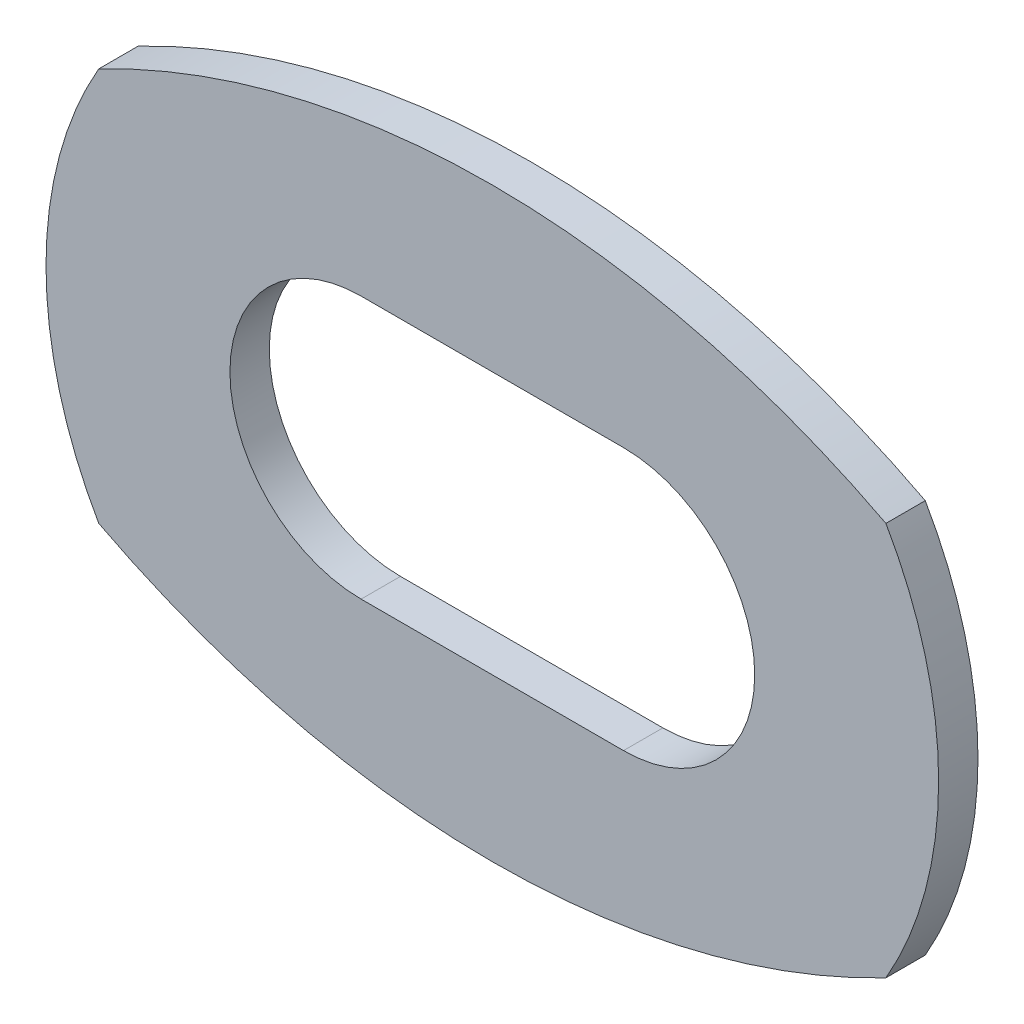
ISO-10303-21;
HEADER;
FILE_DESCRIPTION(('STEP AP214'),'2;1');
FILE_NAME('part.step','',(''),(''),'','','');
FILE_SCHEMA(('AUTOMOTIVE_DESIGN { 1 0 10303 214 1 1 1 1 }'));
ENDSEC;
DATA;
#1=APPLICATION_CONTEXT('core data for automotive mechanical design processes');
#2=APPLICATION_PROTOCOL_DEFINITION('international standard','automotive_design',2000,#1);
#3=PRODUCT_CONTEXT('',#1,'mechanical');
#4=PRODUCT('Part','Part','',(#3));
#5=PRODUCT_RELATED_PRODUCT_CATEGORY('part','',(#4));
#6=PRODUCT_DEFINITION_FORMATION('','',#4);
#7=PRODUCT_DEFINITION_CONTEXT('part definition',#1,'design');
#8=PRODUCT_DEFINITION('design','',#6,#7);
#9=PRODUCT_DEFINITION_SHAPE('','',#8);
#10=(LENGTH_UNIT() NAMED_UNIT(*) SI_UNIT(.MILLI.,.METRE.));
#11=(NAMED_UNIT(*) PLANE_ANGLE_UNIT() SI_UNIT($,.RADIAN.));
#12=(NAMED_UNIT(*) SI_UNIT($,.STERADIAN.) SOLID_ANGLE_UNIT());
#13=UNCERTAINTY_MEASURE_WITH_UNIT(LENGTH_MEASURE(1.E-05),#10,'distance_accuracy_value','');
#14=(GEOMETRIC_REPRESENTATION_CONTEXT(3) GLOBAL_UNCERTAINTY_ASSIGNED_CONTEXT((#13)) GLOBAL_UNIT_ASSIGNED_CONTEXT((#10,
#11,#12)) REPRESENTATION_CONTEXT('',''));
#15=CARTESIAN_POINT('',(0.,0.,0.));
#16=DIRECTION('',(0.,0.,1.));
#17=DIRECTION('',(1.,0.,0.));
#18=AXIS2_PLACEMENT_3D('',#15,#16,#17);
#19=CARTESIAN_POINT('',(-5.53959016798912,-26.5328617626929,3.));
#20=DIRECTION('',(0.,0.,-1.));
#21=DIRECTION('',(-1.,0.,0.));
#22=AXIS2_PLACEMENT_3D('',#19,#20,#21);
#23=CYLINDRICAL_SURFACE('',#22,65.);
#24=CARTESIAN_POINT('',(-5.53959016798912,-26.5328617626929,0.));
#25=DIRECTION('',(0.,0.,1.));
#26=DIRECTION('',(-1.,0.,0.));
#27=AXIS2_PLACEMENT_3D('',#24,#25,#26);
#28=CIRCLE('',#27,65.);
#29=CARTESIAN_POINT('',(24.4604098320109,31.1299512106611,0.));
#30=VERTEX_POINT('',#29);
#31=CARTESIAN_POINT('',(-35.5395901679891,31.1299512106611,0.));
#32=VERTEX_POINT('',#31);
#33=EDGE_CURVE('E130',#30,#32,#28,.T.);
#34=ORIENTED_EDGE('',*,*,#33,.T.);
#35=DIRECTION('',(0.,0.,-1.));
#36=VECTOR('',#35,1.);
#37=CARTESIAN_POINT('',(-35.5395901679891,31.1299512106611,3.));
#38=LINE('',#37,#36);
#39=CARTESIAN_POINT('',(-35.5395901679891,31.1299512106611,3.));
#40=VERTEX_POINT('',#39);
#41=EDGE_CURVE('E11',#40,#32,#38,.T.);
#42=ORIENTED_EDGE('',*,*,#41,.F.);
#43=CARTESIAN_POINT('',(-5.53959016798912,-26.5328617626929,3.));
#44=DIRECTION('',(0.,0.,1.));
#45=DIRECTION('',(-1.,0.,0.));
#46=AXIS2_PLACEMENT_3D('',#43,#44,#45);
#47=CIRCLE('',#46,65.);
#48=CARTESIAN_POINT('',(24.4604098320109,31.1299512106611,3.));
#49=VERTEX_POINT('',#48);
#50=EDGE_CURVE('E134',#49,#40,#47,.T.);
#51=ORIENTED_EDGE('',*,*,#50,.F.);
#52=DIRECTION('',(0.,0.,-1.));
#53=VECTOR('',#52,1.);
#54=CARTESIAN_POINT('',(24.4604098320109,31.1299512106611,3.));
#55=LINE('',#54,#53);
#56=EDGE_CURVE('E144',#49,#30,#55,.T.);
#57=ORIENTED_EDGE('',*,*,#56,.T.);
#58=EDGE_LOOP('',(#34,#42,#51,#57));
#59=FACE_BOUND('',#58,.T.);
#60=ADVANCED_FACE('F33',(#59),#23,.T.);
#61=CARTESIAN_POINT('',(-9.55882805445596,16.1299512106611,3.));
#62=DIRECTION('',(0.,0.,-1.));
#63=DIRECTION('',(-1.,0.,0.));
#64=AXIS2_PLACEMENT_3D('',#61,#62,#63);
#65=CYLINDRICAL_SURFACE('',#64,30.);
#66=CARTESIAN_POINT('',(-9.55882805445596,16.1299512106611,0.));
#67=DIRECTION('',(0.,0.,1.));
#68=DIRECTION('',(1.,0.,0.));
#69=AXIS2_PLACEMENT_3D('',#66,#67,#68);
#70=CIRCLE('',#69,30.);
#71=CARTESIAN_POINT('',(-35.5395901679891,1.12995121066108,0.));
#72=VERTEX_POINT('',#71);
#73=EDGE_CURVE('E147',#32,#72,#70,.T.);
#74=ORIENTED_EDGE('',*,*,#73,.T.);
#75=DIRECTION('',(0.,0.,-1.));
#76=VECTOR('',#75,1.);
#77=CARTESIAN_POINT('',(-35.5395901679891,1.12995121066108,3.));
#78=LINE('',#77,#76);
#79=CARTESIAN_POINT('',(-35.5395901679891,1.12995121066108,3.));
#80=VERTEX_POINT('',#79);
#81=EDGE_CURVE('E40',#80,#72,#78,.T.);
#82=ORIENTED_EDGE('',*,*,#81,.F.);
#83=CARTESIAN_POINT('',(-9.55882805445596,16.1299512106611,3.));
#84=DIRECTION('',(0.,0.,1.));
#85=DIRECTION('',(1.,0.,0.));
#86=AXIS2_PLACEMENT_3D('',#83,#84,#85);
#87=CIRCLE('',#86,30.);
#88=EDGE_CURVE('E137',#40,#80,#87,.T.);
#89=ORIENTED_EDGE('',*,*,#88,.F.);
#90=ORIENTED_EDGE('',*,*,#41,.T.);
#91=EDGE_LOOP('',(#74,#82,#89,#90));
#92=FACE_BOUND('',#91,.T.);
#93=ADVANCED_FACE('F175',(#92),#65,.T.);
#94=CARTESIAN_POINT('',(-5.53959016798912,58.7927641840151,3.));
#95=DIRECTION('',(0.,0.,-1.));
#96=DIRECTION('',(-1.,0.,0.));
#97=AXIS2_PLACEMENT_3D('',#94,#95,#96);
#98=CYLINDRICAL_SURFACE('',#97,65.);
#99=CARTESIAN_POINT('',(-5.53959016798912,58.7927641840151,0.));
#100=DIRECTION('',(0.,0.,1.));
#101=DIRECTION('',(1.,0.,0.));
#102=AXIS2_PLACEMENT_3D('',#99,#100,#101);
#103=CIRCLE('',#102,65.);
#104=CARTESIAN_POINT('',(24.4604098320109,1.12995121066108,0.));
#105=VERTEX_POINT('',#104);
#106=EDGE_CURVE('E149',#72,#105,#103,.T.);
#107=ORIENTED_EDGE('',*,*,#106,.T.);
#108=DIRECTION('',(0.,0.,-1.));
#109=VECTOR('',#108,1.);
#110=CARTESIAN_POINT('',(24.4604098320109,1.12995121066108,3.));
#111=LINE('',#110,#109);
#112=CARTESIAN_POINT('',(24.4604098320109,1.12995121066108,3.));
#113=VERTEX_POINT('',#112);
#114=EDGE_CURVE('E154',#113,#105,#111,.T.);
#115=ORIENTED_EDGE('',*,*,#114,.F.);
#116=CARTESIAN_POINT('',(-5.53959016798912,58.7927641840151,3.));
#117=DIRECTION('',(0.,0.,1.));
#118=DIRECTION('',(1.,0.,0.));
#119=AXIS2_PLACEMENT_3D('',#116,#117,#118);
#120=CIRCLE('',#119,65.);
#121=EDGE_CURVE('E140',#80,#113,#120,.T.);
#122=ORIENTED_EDGE('',*,*,#121,.F.);
#123=ORIENTED_EDGE('',*,*,#81,.T.);
#124=EDGE_LOOP('',(#107,#115,#122,#123));
#125=FACE_BOUND('',#124,.T.);
#126=ADVANCED_FACE('F161',(#125),#98,.T.);
#127=CARTESIAN_POINT('',(-1.52035228152228,16.1299512106611,3.));
#128=DIRECTION('',(0.,0.,-1.));
#129=DIRECTION('',(-1.,0.,0.));
#130=AXIS2_PLACEMENT_3D('',#127,#128,#129);
#131=CYLINDRICAL_SURFACE('',#130,30.);
#132=CARTESIAN_POINT('',(-1.52035228152228,16.1299512106611,0.));
#133=DIRECTION('',(0.,0.,1.));
#134=DIRECTION('',(-1.,0.,0.));
#135=AXIS2_PLACEMENT_3D('',#132,#133,#134);
#136=CIRCLE('',#135,30.);
#137=EDGE_CURVE('E138',#105,#30,#136,.T.);
#138=ORIENTED_EDGE('',*,*,#137,.T.);
#139=ORIENTED_EDGE('',*,*,#56,.F.);
#140=CARTESIAN_POINT('',(-1.52035228152228,16.1299512106611,3.));
#141=DIRECTION('',(0.,0.,1.));
#142=DIRECTION('',(-1.,0.,0.));
#143=AXIS2_PLACEMENT_3D('',#140,#141,#142);
#144=CIRCLE('',#143,30.);
#145=EDGE_CURVE('E142',#113,#49,#144,.T.);
#146=ORIENTED_EDGE('',*,*,#145,.F.);
#147=ORIENTED_EDGE('',*,*,#114,.T.);
#148=EDGE_LOOP('',(#138,#139,#146,#147));
#149=FACE_BOUND('',#148,.T.);
#150=ADVANCED_FACE('F168',(#149),#131,.T.);
#151=CARTESIAN_POINT('',(-3.5299712247557,-5.20145527601592,3.));
#152=DIRECTION('',(0.,0.,-1.));
#153=DIRECTION('',(-1.,0.,0.));
#154=AXIS2_PLACEMENT_3D('',#151,#152,#153);
#155=PLANE('',#154);
#156=DIRECTION('',(1.,0.,0.));
#157=VECTOR('',#156,1.);
#158=CARTESIAN_POINT('',(-15.5395901679891,6.12995121066108,3.));
#159=LINE('',#158,#157);
#160=CARTESIAN_POINT('',(-15.5395901679891,6.12995121066108,3.));
#161=VERTEX_POINT('',#160);
#162=CARTESIAN_POINT('',(4.46040983201088,6.12995121066107,3.));
#163=VERTEX_POINT('',#162);
#164=EDGE_CURVE('E124',#161,#163,#159,.T.);
#165=ORIENTED_EDGE('',*,*,#164,.F.);
#166=CARTESIAN_POINT('',(-15.5395901679891,16.1299512106611,3.));
#167=DIRECTION('',(0.,0.,1.));
#168=DIRECTION('',(1.,0.,0.));
#169=AXIS2_PLACEMENT_3D('',#166,#167,#168);
#170=CIRCLE('',#169,10.);
#171=CARTESIAN_POINT('',(-15.5395901679891,26.1299512106611,3.));
#172=VERTEX_POINT('',#171);
#173=EDGE_CURVE('E47',#172,#161,#170,.T.);
#174=ORIENTED_EDGE('',*,*,#173,.F.);
#175=DIRECTION('',(-1.,0.,0.));
#176=VECTOR('',#175,1.);
#177=CARTESIAN_POINT('',(-15.5395901679891,26.1299512106611,3.));
#178=LINE('',#177,#176);
#179=CARTESIAN_POINT('',(4.46040983201088,26.1299512106611,3.));
#180=VERTEX_POINT('',#179);
#181=EDGE_CURVE('E115',#180,#172,#178,.T.);
#182=ORIENTED_EDGE('',*,*,#181,.F.);
#183=CARTESIAN_POINT('',(4.46040983201088,16.1299512106611,3.));
#184=DIRECTION('',(0.,0.,1.));
#185=DIRECTION('',(-1.,0.,0.));
#186=AXIS2_PLACEMENT_3D('',#183,#184,#185);
#187=CIRCLE('',#186,10.);
#188=EDGE_CURVE('E118',#163,#180,#187,.T.);
#189=ORIENTED_EDGE('',*,*,#188,.F.);
#190=EDGE_LOOP('',(#165,#174,#182,#189));
#191=FACE_BOUND('',#190,.T.);
#192=ORIENTED_EDGE('',*,*,#50,.T.);
#193=ORIENTED_EDGE('',*,*,#88,.T.);
#194=ORIENTED_EDGE('',*,*,#121,.T.);
#195=ORIENTED_EDGE('',*,*,#145,.T.);
#196=EDGE_LOOP('',(#192,#193,#194,#195));
#197=FACE_BOUND('',#196,.T.);
#198=ADVANCED_FACE('F174',(#191,#197),#155,.F.);
#199=CARTESIAN_POINT('',(-3.5299712247557,-5.20145527601592,0.));
#200=DIRECTION('',(0.,0.,-1.));
#201=DIRECTION('',(-1.,0.,0.));
#202=AXIS2_PLACEMENT_3D('',#199,#200,#201);
#203=PLANE('',#202);
#204=CARTESIAN_POINT('',(-15.5395901679891,16.1299512106611,0.));
#205=DIRECTION('',(0.,0.,1.));
#206=DIRECTION('',(1.,0.,0.));
#207=AXIS2_PLACEMENT_3D('',#204,#205,#206);
#208=CIRCLE('',#207,10.);
#209=CARTESIAN_POINT('',(-15.5395901679891,26.1299512106611,0.));
#210=VERTEX_POINT('',#209);
#211=CARTESIAN_POINT('',(-15.5395901679891,6.12995121066108,0.));
#212=VERTEX_POINT('',#211);
#213=EDGE_CURVE('E99',#210,#212,#208,.T.);
#214=ORIENTED_EDGE('',*,*,#213,.T.);
#215=DIRECTION('',(1.,0.,0.));
#216=VECTOR('',#215,1.);
#217=CARTESIAN_POINT('',(-15.5395901679891,6.12995121066108,0.));
#218=LINE('',#217,#216);
#219=CARTESIAN_POINT('',(4.46040983201088,6.12995121066107,0.));
#220=VERTEX_POINT('',#219);
#221=EDGE_CURVE('E108',#212,#220,#218,.T.);
#222=ORIENTED_EDGE('',*,*,#221,.T.);
#223=CARTESIAN_POINT('',(4.46040983201088,16.1299512106611,0.));
#224=DIRECTION('',(0.,0.,1.));
#225=DIRECTION('',(-1.,0.,0.));
#226=AXIS2_PLACEMENT_3D('',#223,#224,#225);
#227=CIRCLE('',#226,10.);
#228=CARTESIAN_POINT('',(4.46040983201088,26.1299512106611,0.));
#229=VERTEX_POINT('',#228);
#230=EDGE_CURVE('E55',#220,#229,#227,.T.);
#231=ORIENTED_EDGE('',*,*,#230,.T.);
#232=DIRECTION('',(-1.,0.,0.));
#233=VECTOR('',#232,1.);
#234=CARTESIAN_POINT('',(-15.5395901679891,26.1299512106611,0.));
#235=LINE('',#234,#233);
#236=EDGE_CURVE('E105',#229,#210,#235,.T.);
#237=ORIENTED_EDGE('',*,*,#236,.T.);
#238=EDGE_LOOP('',(#214,#222,#231,#237));
#239=FACE_BOUND('',#238,.T.);
#240=ORIENTED_EDGE('',*,*,#33,.F.);
#241=ORIENTED_EDGE('',*,*,#137,.F.);
#242=ORIENTED_EDGE('',*,*,#106,.F.);
#243=ORIENTED_EDGE('',*,*,#73,.F.);
#244=EDGE_LOOP('',(#240,#241,#242,#243));
#245=FACE_BOUND('',#244,.T.);
#246=ADVANCED_FACE('F112',(#239,#245),#203,.T.);
#247=CARTESIAN_POINT('',(-15.5395901679891,16.1299512106611,0.));
#248=DIRECTION('',(0.,0.,1.));
#249=DIRECTION('',(1.,0.,0.));
#250=AXIS2_PLACEMENT_3D('',#247,#248,#249);
#251=CYLINDRICAL_SURFACE('',#250,10.);
#252=ORIENTED_EDGE('',*,*,#173,.T.);
#253=DIRECTION('',(0.,0.,1.));
#254=VECTOR('',#253,1.);
#255=CARTESIAN_POINT('',(-15.5395901679891,6.12995121066108,0.));
#256=LINE('',#255,#254);
#257=EDGE_CURVE('E95',#212,#161,#256,.T.);
#258=ORIENTED_EDGE('',*,*,#257,.F.);
#259=ORIENTED_EDGE('',*,*,#213,.F.);
#260=DIRECTION('',(0.,0.,1.));
#261=VECTOR('',#260,1.);
#262=CARTESIAN_POINT('',(-15.5395901679891,26.1299512106611,0.));
#263=LINE('',#262,#261);
#264=EDGE_CURVE('E128',#210,#172,#263,.T.);
#265=ORIENTED_EDGE('',*,*,#264,.T.);
#266=EDGE_LOOP('',(#252,#258,#259,#265));
#267=FACE_BOUND('',#266,.T.);
#268=ADVANCED_FACE('F97',(#267),#251,.F.);
#269=CARTESIAN_POINT('',(-15.5395901679891,26.1299512106611,0.));
#270=DIRECTION('',(0.,1.,0.));
#271=DIRECTION('',(-1.,0.,0.));
#272=AXIS2_PLACEMENT_3D('',#269,#270,#271);
#273=PLANE('',#272);
#274=ORIENTED_EDGE('',*,*,#181,.T.);
#275=ORIENTED_EDGE('',*,*,#264,.F.);
#276=ORIENTED_EDGE('',*,*,#236,.F.);
#277=DIRECTION('',(0.,0.,1.));
#278=VECTOR('',#277,1.);
#279=CARTESIAN_POINT('',(4.46040983201088,26.1299512106611,0.));
#280=LINE('',#279,#278);
#281=EDGE_CURVE('E131',#229,#180,#280,.T.);
#282=ORIENTED_EDGE('',*,*,#281,.T.);
#283=EDGE_LOOP('',(#274,#275,#276,#282));
#284=FACE_BOUND('',#283,.T.);
#285=ADVANCED_FACE('F192',(#284),#273,.F.);
#286=CARTESIAN_POINT('',(4.46040983201088,16.1299512106611,0.));
#287=DIRECTION('',(0.,0.,1.));
#288=DIRECTION('',(1.,0.,0.));
#289=AXIS2_PLACEMENT_3D('',#286,#287,#288);
#290=CYLINDRICAL_SURFACE('',#289,10.);
#291=ORIENTED_EDGE('',*,*,#188,.T.);
#292=ORIENTED_EDGE('',*,*,#281,.F.);
#293=ORIENTED_EDGE('',*,*,#230,.F.);
#294=DIRECTION('',(0.,0.,1.));
#295=VECTOR('',#294,1.);
#296=CARTESIAN_POINT('',(4.46040983201088,6.12995121066107,0.));
#297=LINE('',#296,#295);
#298=EDGE_CURVE('E104',#220,#163,#297,.T.);
#299=ORIENTED_EDGE('',*,*,#298,.T.);
#300=EDGE_LOOP('',(#291,#292,#293,#299));
#301=FACE_BOUND('',#300,.T.);
#302=ADVANCED_FACE('F195',(#301),#290,.F.);
#303=CARTESIAN_POINT('',(-15.5395901679891,6.12995121066108,0.));
#304=DIRECTION('',(0.,-1.,0.));
#305=DIRECTION('',(1.,0.,0.));
#306=AXIS2_PLACEMENT_3D('',#303,#304,#305);
#307=PLANE('',#306);
#308=ORIENTED_EDGE('',*,*,#164,.T.);
#309=ORIENTED_EDGE('',*,*,#298,.F.);
#310=ORIENTED_EDGE('',*,*,#221,.F.);
#311=ORIENTED_EDGE('',*,*,#257,.T.);
#312=EDGE_LOOP('',(#308,#309,#310,#311));
#313=FACE_BOUND('',#312,.T.);
#314=ADVANCED_FACE('F109',(#313),#307,.F.);
#315=CLOSED_SHELL('',(#60,#93,#126,#150,#198,#246,#268,#285,#302,#314));
#316=MANIFOLD_SOLID_BREP('B2',#315);
#317=ADVANCED_BREP_SHAPE_REPRESENTATION('',(#18,#316),#14);
#318=SHAPE_DEFINITION_REPRESENTATION(#9,#317);
ENDSEC;
END-ISO-10303-21;
